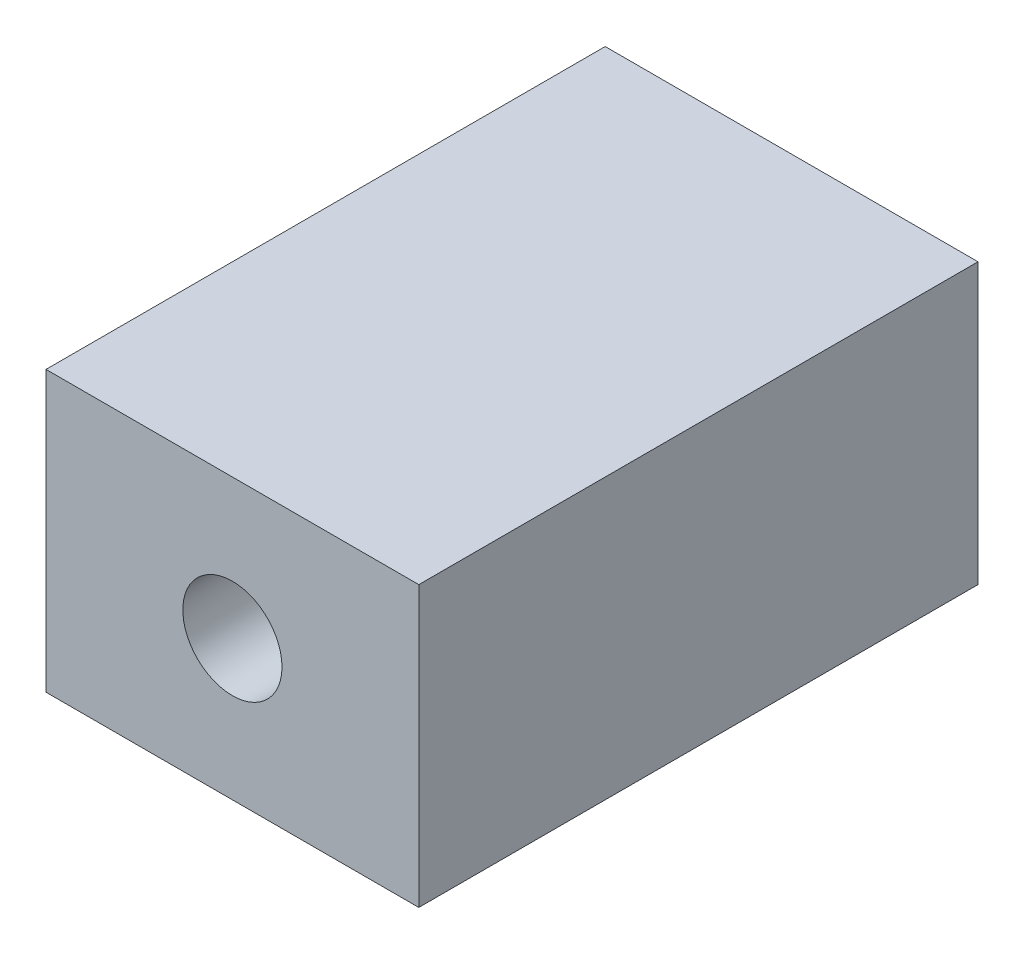
ISO-10303-21;
HEADER;
FILE_DESCRIPTION(('STEP AP214'),'2;1');
FILE_NAME('part.step','',(''),(''),'','','');
FILE_SCHEMA(('AUTOMOTIVE_DESIGN { 1 0 10303 214 1 1 1 1 }'));
ENDSEC;
DATA;
#1=APPLICATION_CONTEXT('core data for automotive mechanical design processes');
#2=APPLICATION_PROTOCOL_DEFINITION('international standard','automotive_design',2000,#1);
#3=PRODUCT_CONTEXT('',#1,'mechanical');
#4=PRODUCT('Part','Part','',(#3));
#5=PRODUCT_RELATED_PRODUCT_CATEGORY('part','',(#4));
#6=PRODUCT_DEFINITION_FORMATION('','',#4);
#7=PRODUCT_DEFINITION_CONTEXT('part definition',#1,'design');
#8=PRODUCT_DEFINITION('design','',#6,#7);
#9=PRODUCT_DEFINITION_SHAPE('','',#8);
#10=(LENGTH_UNIT() NAMED_UNIT(*) SI_UNIT(.MILLI.,.METRE.));
#11=(NAMED_UNIT(*) PLANE_ANGLE_UNIT() SI_UNIT($,.RADIAN.));
#12=(NAMED_UNIT(*) SI_UNIT($,.STERADIAN.) SOLID_ANGLE_UNIT());
#13=UNCERTAINTY_MEASURE_WITH_UNIT(LENGTH_MEASURE(1.E-05),#10,'distance_accuracy_value','');
#14=(GEOMETRIC_REPRESENTATION_CONTEXT(3) GLOBAL_UNCERTAINTY_ASSIGNED_CONTEXT((#13)) GLOBAL_UNIT_ASSIGNED_CONTEXT((#10,
#11,#12)) REPRESENTATION_CONTEXT('',''));
#15=CARTESIAN_POINT('',(0.,0.,0.));
#16=DIRECTION('',(0.,0.,1.));
#17=DIRECTION('',(1.,0.,0.));
#18=AXIS2_PLACEMENT_3D('',#15,#16,#17);
#19=CARTESIAN_POINT('',(12.7,9.525,19.05));
#20=DIRECTION('',(-1.,0.,0.));
#21=DIRECTION('',(0.,0.,1.));
#22=AXIS2_PLACEMENT_3D('',#19,#20,#21);
#23=PLANE('',#22);
#24=DIRECTION('',(0.,0.,-1.));
#25=VECTOR('',#24,1.);
#26=CARTESIAN_POINT('',(12.7,-9.525,19.05));
#27=LINE('',#26,#25);
#28=CARTESIAN_POINT('',(12.7,-9.525,19.05));
#29=VERTEX_POINT('',#28);
#30=CARTESIAN_POINT('',(12.7,-9.525,-19.05));
#31=VERTEX_POINT('',#30);
#32=EDGE_CURVE('E131',#29,#31,#27,.T.);
#33=ORIENTED_EDGE('',*,*,#32,.T.);
#34=DIRECTION('',(0.,-1.,0.));
#35=VECTOR('',#34,1.);
#36=CARTESIAN_POINT('',(12.7,9.525,-19.05));
#37=LINE('',#36,#35);
#38=CARTESIAN_POINT('',(12.7,9.525,-19.05));
#39=VERTEX_POINT('',#38);
#40=EDGE_CURVE('E11',#39,#31,#37,.T.);
#41=ORIENTED_EDGE('',*,*,#40,.F.);
#42=DIRECTION('',(0.,0.,-1.));
#43=VECTOR('',#42,1.);
#44=CARTESIAN_POINT('',(12.7,9.525,19.05));
#45=LINE('',#44,#43);
#46=CARTESIAN_POINT('',(12.7,9.525,19.05));
#47=VERTEX_POINT('',#46);
#48=EDGE_CURVE('E132',#47,#39,#45,.T.);
#49=ORIENTED_EDGE('',*,*,#48,.F.);
#50=DIRECTION('',(0.,-1.,0.));
#51=VECTOR('',#50,1.);
#52=CARTESIAN_POINT('',(12.7,9.525,19.05));
#53=LINE('',#52,#51);
#54=EDGE_CURVE('E142',#47,#29,#53,.T.);
#55=ORIENTED_EDGE('',*,*,#54,.T.);
#56=EDGE_LOOP('',(#33,#41,#49,#55));
#57=FACE_BOUND('',#56,.T.);
#58=ADVANCED_FACE('F43',(#57),#23,.F.);
#59=CARTESIAN_POINT('',(-12.7,9.525,-19.05));
#60=DIRECTION('',(0.,0.,1.));
#61=DIRECTION('',(1.,0.,0.));
#62=AXIS2_PLACEMENT_3D('',#59,#60,#61);
#63=PLANE('',#62);
#64=CARTESIAN_POINT('',(0.,0.,-19.05));
#65=DIRECTION('',(0.,0.,1.));
#66=DIRECTION('',(1.,0.,0.));
#67=AXIS2_PLACEMENT_3D('',#64,#65,#66);
#68=CIRCLE('',#67,3.37819999999999);
#69=CARTESIAN_POINT('',(3.37819999999999,0.,-19.05));
#70=VERTEX_POINT('',#69);
#71=EDGE_CURVE('E127',#70,#70,#68,.T.);
#72=ORIENTED_EDGE('',*,*,#71,.T.);
#73=EDGE_LOOP('',(#72));
#74=FACE_BOUND('',#73,.T.);
#75=DIRECTION('',(-1.,0.,0.));
#76=VECTOR('',#75,1.);
#77=CARTESIAN_POINT('',(-12.7,-9.525,-19.05));
#78=LINE('',#77,#76);
#79=CARTESIAN_POINT('',(-12.7,-9.525,-19.05));
#80=VERTEX_POINT('',#79);
#81=EDGE_CURVE('E146',#31,#80,#78,.T.);
#82=ORIENTED_EDGE('',*,*,#81,.T.);
#83=DIRECTION('',(0.,-1.,0.));
#84=VECTOR('',#83,1.);
#85=CARTESIAN_POINT('',(-12.7,9.525,-19.05));
#86=LINE('',#85,#84);
#87=CARTESIAN_POINT('',(-12.7,9.525,-19.05));
#88=VERTEX_POINT('',#87);
#89=EDGE_CURVE('E52',#88,#80,#86,.T.);
#90=ORIENTED_EDGE('',*,*,#89,.F.);
#91=DIRECTION('',(-1.,0.,0.));
#92=VECTOR('',#91,1.);
#93=CARTESIAN_POINT('',(-12.7,9.525,-19.05));
#94=LINE('',#93,#92);
#95=EDGE_CURVE('E91',#39,#88,#94,.T.);
#96=ORIENTED_EDGE('',*,*,#95,.F.);
#97=ORIENTED_EDGE('',*,*,#40,.T.);
#98=EDGE_LOOP('',(#82,#90,#96,#97));
#99=FACE_BOUND('',#98,.T.);
#100=ADVANCED_FACE('F176',(#74,#99),#63,.F.);
#101=CARTESIAN_POINT('',(-12.7,9.525,19.05));
#102=DIRECTION('',(1.,0.,0.));
#103=DIRECTION('',(0.,0.,-1.));
#104=AXIS2_PLACEMENT_3D('',#101,#102,#103);
#105=PLANE('',#104);
#106=DIRECTION('',(0.,0.,1.));
#107=VECTOR('',#106,1.);
#108=CARTESIAN_POINT('',(-12.7,-9.525,19.05));
#109=LINE('',#108,#107);
#110=CARTESIAN_POINT('',(-12.7,-9.525,19.05));
#111=VERTEX_POINT('',#110);
#112=EDGE_CURVE('E78',#80,#111,#109,.T.);
#113=ORIENTED_EDGE('',*,*,#112,.T.);
#114=DIRECTION('',(0.,-1.,0.));
#115=VECTOR('',#114,1.);
#116=CARTESIAN_POINT('',(-12.7,9.525,19.05));
#117=LINE('',#116,#115);
#118=CARTESIAN_POINT('',(-12.7,9.525,19.05));
#119=VERTEX_POINT('',#118);
#120=EDGE_CURVE('E155',#119,#111,#117,.T.);
#121=ORIENTED_EDGE('',*,*,#120,.F.);
#122=DIRECTION('',(0.,0.,1.));
#123=VECTOR('',#122,1.);
#124=CARTESIAN_POINT('',(-12.7,9.525,19.05));
#125=LINE('',#124,#123);
#126=EDGE_CURVE('E137',#88,#119,#125,.T.);
#127=ORIENTED_EDGE('',*,*,#126,.F.);
#128=ORIENTED_EDGE('',*,*,#89,.T.);
#129=EDGE_LOOP('',(#113,#121,#127,#128));
#130=FACE_BOUND('',#129,.T.);
#131=ADVANCED_FACE('F159',(#130),#105,.F.);
#132=CARTESIAN_POINT('',(-12.7,9.525,19.05));
#133=DIRECTION('',(0.,0.,-1.));
#134=DIRECTION('',(-1.,0.,0.));
#135=AXIS2_PLACEMENT_3D('',#132,#133,#134);
#136=PLANE('',#135);
#137=CARTESIAN_POINT('',(0.,0.,19.05));
#138=DIRECTION('',(0.,0.,1.));
#139=DIRECTION('',(1.,0.,0.));
#140=AXIS2_PLACEMENT_3D('',#137,#138,#139);
#141=CIRCLE('',#140,3.3782);
#142=CARTESIAN_POINT('',(3.3782,0.,19.05));
#143=VERTEX_POINT('',#142);
#144=EDGE_CURVE('E123',#143,#143,#141,.T.);
#145=ORIENTED_EDGE('',*,*,#144,.F.);
#146=EDGE_LOOP('',(#145));
#147=FACE_BOUND('',#146,.T.);
#148=DIRECTION('',(1.,0.,0.));
#149=VECTOR('',#148,1.);
#150=CARTESIAN_POINT('',(-12.7,-9.525,19.05));
#151=LINE('',#150,#149);
#152=EDGE_CURVE('E84',#111,#29,#151,.T.);
#153=ORIENTED_EDGE('',*,*,#152,.T.);
#154=ORIENTED_EDGE('',*,*,#54,.F.);
#155=DIRECTION('',(1.,0.,0.));
#156=VECTOR('',#155,1.);
#157=CARTESIAN_POINT('',(-12.7,9.525,19.05));
#158=LINE('',#157,#156);
#159=EDGE_CURVE('E60',#119,#47,#158,.T.);
#160=ORIENTED_EDGE('',*,*,#159,.F.);
#161=ORIENTED_EDGE('',*,*,#120,.T.);
#162=EDGE_LOOP('',(#153,#154,#160,#161));
#163=FACE_BOUND('',#162,.T.);
#164=ADVANCED_FACE('F166',(#147,#163),#136,.F.);
#165=CARTESIAN_POINT('',(0.,9.525,0.));
#166=DIRECTION('',(0.,-1.,0.));
#167=DIRECTION('',(0.,0.,-1.));
#168=AXIS2_PLACEMENT_3D('',#165,#166,#167);
#169=PLANE('',#168);
#170=ORIENTED_EDGE('',*,*,#48,.T.);
#171=ORIENTED_EDGE('',*,*,#95,.T.);
#172=ORIENTED_EDGE('',*,*,#126,.T.);
#173=ORIENTED_EDGE('',*,*,#159,.T.);
#174=EDGE_LOOP('',(#170,#171,#172,#173));
#175=FACE_BOUND('',#174,.T.);
#176=ADVANCED_FACE('F168',(#175),#169,.F.);
#177=CARTESIAN_POINT('',(0.,-9.525,0.));
#178=DIRECTION('',(0.,-1.,0.));
#179=DIRECTION('',(0.,0.,-1.));
#180=AXIS2_PLACEMENT_3D('',#177,#178,#179);
#181=PLANE('',#180);
#182=CARTESIAN_POINT('',(-8.89,-9.525,12.7));
#183=DIRECTION('',(0.,-1.,0.));
#184=DIRECTION('',(0.,0.,-1.));
#185=AXIS2_PLACEMENT_3D('',#182,#183,#184);
#186=CIRCLE('',#185,1.7272);
#187=CARTESIAN_POINT('',(-8.89,-9.525,10.9728));
#188=VERTEX_POINT('',#187);
#189=EDGE_CURVE('E110',#188,#188,#186,.T.);
#190=ORIENTED_EDGE('',*,*,#189,.F.);
#191=EDGE_LOOP('',(#190));
#192=FACE_BOUND('',#191,.T.);
#193=CARTESIAN_POINT('',(8.89,-9.525,-12.7));
#194=DIRECTION('',(0.,-1.,0.));
#195=DIRECTION('',(0.,0.,-1.));
#196=AXIS2_PLACEMENT_3D('',#193,#194,#195);
#197=CIRCLE('',#196,1.7272);
#198=CARTESIAN_POINT('',(8.89,-9.525,-14.4272));
#199=VERTEX_POINT('',#198);
#200=EDGE_CURVE('E109',#199,#199,#197,.T.);
#201=ORIENTED_EDGE('',*,*,#200,.F.);
#202=EDGE_LOOP('',(#201));
#203=FACE_BOUND('',#202,.T.);
#204=ORIENTED_EDGE('',*,*,#32,.F.);
#205=ORIENTED_EDGE('',*,*,#152,.F.);
#206=ORIENTED_EDGE('',*,*,#112,.F.);
#207=ORIENTED_EDGE('',*,*,#81,.F.);
#208=EDGE_LOOP('',(#204,#205,#206,#207));
#209=FACE_BOUND('',#208,.T.);
#210=ADVANCED_FACE('F162',(#192,#203,#209),#181,.T.);
#211=CARTESIAN_POINT('',(0.,0.,19.05));
#212=DIRECTION('',(0.,0.,1.));
#213=DIRECTION('',(1.,0.,0.));
#214=AXIS2_PLACEMENT_3D('',#211,#212,#213);
#215=CYLINDRICAL_SURFACE('',#214,3.37819999999999);
#216=ORIENTED_EDGE('',*,*,#71,.F.);
#217=EDGE_LOOP('',(#216));
#218=FACE_BOUND('',#217,.T.);
#219=ORIENTED_EDGE('',*,*,#144,.T.);
#220=EDGE_LOOP('',(#219));
#221=FACE_BOUND('',#220,.T.);
#222=ADVANCED_FACE('F189',(#218,#221),#215,.F.);
#223=CARTESIAN_POINT('',(8.89,1.143,-12.7));
#224=DIRECTION('',(0.,-1.,0.));
#225=DIRECTION('',(0.,0.,-1.));
#226=AXIS2_PLACEMENT_3D('',#223,#224,#225);
#227=CONICAL_SURFACE('',#226,1.72719999999999,1.02974425867665);
#228=CARTESIAN_POINT('',(8.89,2.1808064611844,-12.7));
#229=VERTEX_POINT('',#228);
#230=VERTEX_LOOP('',#229);
#231=FACE_BOUND('',#230,.T.);
#232=CARTESIAN_POINT('',(8.89,1.143,-12.7));
#233=DIRECTION('',(0.,-1.,0.));
#234=DIRECTION('',(0.,0.,-1.));
#235=AXIS2_PLACEMENT_3D('',#232,#233,#234);
#236=CIRCLE('',#235,1.72719999999999);
#237=CARTESIAN_POINT('',(8.89,1.143,-14.4272));
#238=VERTEX_POINT('',#237);
#239=EDGE_CURVE('E115',#238,#238,#236,.T.);
#240=ORIENTED_EDGE('',*,*,#239,.T.);
#241=EDGE_LOOP('',(#240));
#242=FACE_BOUND('',#241,.T.);
#243=ADVANCED_FACE('F192',(#231,#242),#227,.F.);
#244=CARTESIAN_POINT('',(8.89,-9.525,-12.7));
#245=DIRECTION('',(0.,-1.,0.));
#246=DIRECTION('',(0.,0.,-1.));
#247=AXIS2_PLACEMENT_3D('',#244,#245,#246);
#248=CYLINDRICAL_SURFACE('',#247,1.7272);
#249=ORIENTED_EDGE('',*,*,#239,.F.);
#250=EDGE_LOOP('',(#249));
#251=FACE_BOUND('',#250,.T.);
#252=ORIENTED_EDGE('',*,*,#200,.T.);
#253=EDGE_LOOP('',(#252));
#254=FACE_BOUND('',#253,.T.);
#255=ADVANCED_FACE('F102',(#251,#254),#248,.F.);
#256=CARTESIAN_POINT('',(-8.89,1.143,12.7));
#257=DIRECTION('',(0.,-1.,0.));
#258=DIRECTION('',(0.,0.,-1.));
#259=AXIS2_PLACEMENT_3D('',#256,#257,#258);
#260=CONICAL_SURFACE('',#259,1.72719999999999,1.02974425867665);
#261=CARTESIAN_POINT('',(-8.89000000000001,2.1808064611844,12.7));
#262=VERTEX_POINT('',#261);
#263=VERTEX_LOOP('',#262);
#264=FACE_BOUND('',#263,.T.);
#265=CARTESIAN_POINT('',(-8.89,1.143,12.7));
#266=DIRECTION('',(0.,-1.,0.));
#267=DIRECTION('',(0.,0.,-1.));
#268=AXIS2_PLACEMENT_3D('',#265,#266,#267);
#269=CIRCLE('',#268,1.72719999999999);
#270=CARTESIAN_POINT('',(-8.89,1.143,10.9728));
#271=VERTEX_POINT('',#270);
#272=EDGE_CURVE('E106',#271,#271,#269,.T.);
#273=ORIENTED_EDGE('',*,*,#272,.T.);
#274=EDGE_LOOP('',(#273));
#275=FACE_BOUND('',#274,.T.);
#276=ADVANCED_FACE('F98',(#264,#275),#260,.F.);
#277=CARTESIAN_POINT('',(-8.89,-9.525,12.7));
#278=DIRECTION('',(0.,-1.,0.));
#279=DIRECTION('',(0.,0.,-1.));
#280=AXIS2_PLACEMENT_3D('',#277,#278,#279);
#281=CYLINDRICAL_SURFACE('',#280,1.7272);
#282=ORIENTED_EDGE('',*,*,#272,.F.);
#283=EDGE_LOOP('',(#282));
#284=FACE_BOUND('',#283,.T.);
#285=ORIENTED_EDGE('',*,*,#189,.T.);
#286=EDGE_LOOP('',(#285));
#287=FACE_BOUND('',#286,.T.);
#288=ADVANCED_FACE('F101',(#284,#287),#281,.F.);
#289=CLOSED_SHELL('',(#58,#100,#131,#164,#176,#210,#222,#243,#255,#276,#288));
#290=MANIFOLD_SOLID_BREP('B2',#289);
#291=ADVANCED_BREP_SHAPE_REPRESENTATION('',(#18,#290),#14);
#292=SHAPE_DEFINITION_REPRESENTATION(#9,#291);
ENDSEC;
END-ISO-10303-21;
